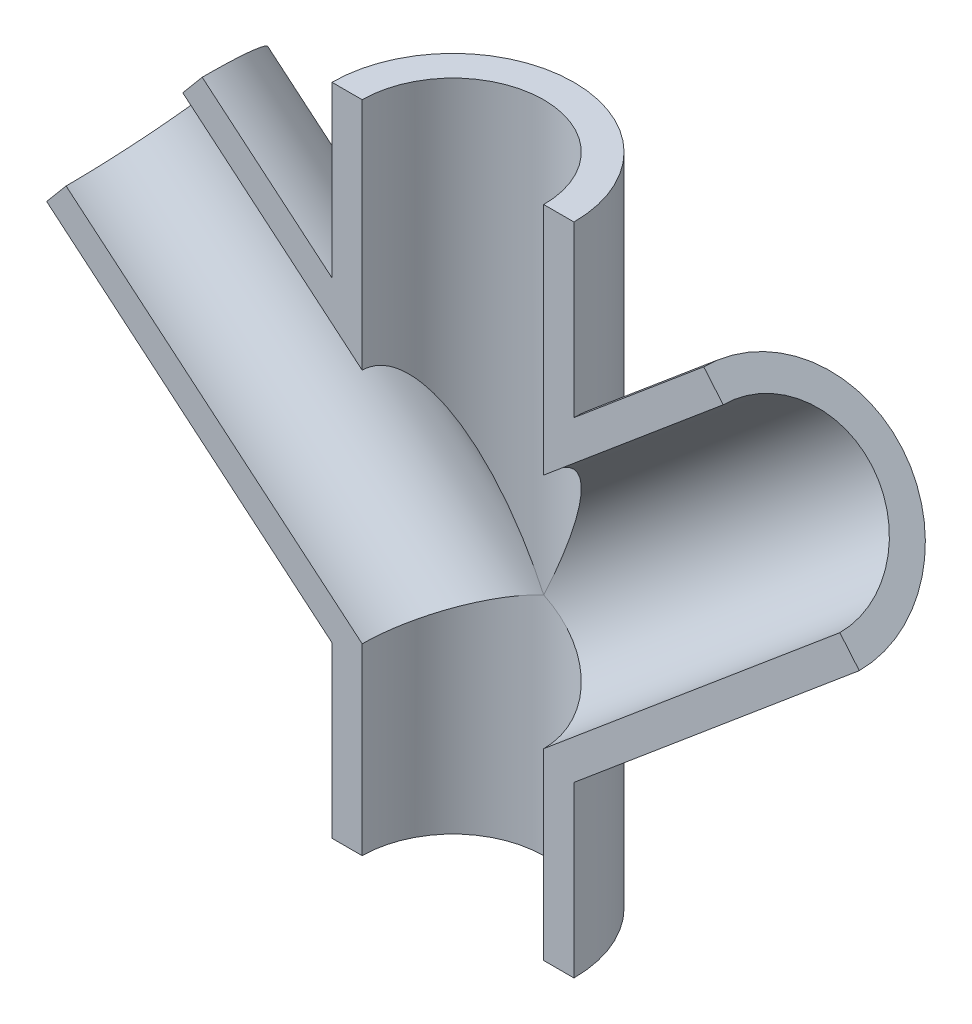
ISO-10303-21;
HEADER;
FILE_DESCRIPTION(('STEP AP214'),'2;1');
FILE_NAME('part.step','',(''),(''),'','','');
FILE_SCHEMA(('AUTOMOTIVE_DESIGN { 1 0 10303 214 1 1 1 1 }'));
ENDSEC;
DATA;
#1=APPLICATION_CONTEXT('core data for automotive mechanical design processes');
#2=APPLICATION_PROTOCOL_DEFINITION('international standard','automotive_design',2000,#1);
#3=PRODUCT_CONTEXT('',#1,'mechanical');
#4=PRODUCT('Part','Part','',(#3));
#5=PRODUCT_RELATED_PRODUCT_CATEGORY('part','',(#4));
#6=PRODUCT_DEFINITION_FORMATION('','',#4);
#7=PRODUCT_DEFINITION_CONTEXT('part definition',#1,'design');
#8=PRODUCT_DEFINITION('design','',#6,#7);
#9=PRODUCT_DEFINITION_SHAPE('','',#8);
#10=(LENGTH_UNIT() NAMED_UNIT(*) SI_UNIT(.MILLI.,.METRE.));
#11=(NAMED_UNIT(*) PLANE_ANGLE_UNIT() SI_UNIT($,.RADIAN.));
#12=(NAMED_UNIT(*) SI_UNIT($,.STERADIAN.) SOLID_ANGLE_UNIT());
#13=UNCERTAINTY_MEASURE_WITH_UNIT(LENGTH_MEASURE(1.E-05),#10,'distance_accuracy_value','');
#14=(GEOMETRIC_REPRESENTATION_CONTEXT(3) GLOBAL_UNCERTAINTY_ASSIGNED_CONTEXT((#13)) GLOBAL_UNIT_ASSIGNED_CONTEXT((#10,
#11,#12)) REPRESENTATION_CONTEXT('',''));
#15=CARTESIAN_POINT('',(0.,0.,0.));
#16=DIRECTION('',(0.,0.,1.));
#17=DIRECTION('',(1.,0.,0.));
#18=AXIS2_PLACEMENT_3D('',#15,#16,#17);
#19=CARTESIAN_POINT('',(0.,0.,0.));
#20=DIRECTION('',(0.,0.,1.));
#21=DIRECTION('',(1.,0.,0.));
#22=AXIS2_PLACEMENT_3D('',#19,#20,#21);
#23=PLANE('',#22);
#24=DIRECTION('',(0.,-1.,0.));
#25=VECTOR('',#24,1.);
#26=CARTESIAN_POINT('',(-5.,7.,0.));
#27=LINE('',#26,#25);
#28=CARTESIAN_POINT('',(-5.,0.,0.));
#29=VERTEX_POINT('',#28);
#30=CARTESIAN_POINT('',(-5.,7.,0.));
#31=VERTEX_POINT('',#30);
#32=EDGE_CURVE('E116',#29,#31,#27,.F.);
#33=ORIENTED_EDGE('',*,*,#32,.F.);
#34=DIRECTION('',(1.,0.,0.));
#35=VECTOR('',#34,1.);
#36=CARTESIAN_POINT('',(-5.,0.,0.));
#37=LINE('',#36,#35);
#38=CARTESIAN_POINT('',(-3.74999999999999,0.,0.));
#39=VERTEX_POINT('',#38);
#40=EDGE_CURVE('E174',#29,#39,#37,.T.);
#41=ORIENTED_EDGE('',*,*,#40,.T.);
#42=DIRECTION('',(0.,1.,0.));
#43=VECTOR('',#42,1.);
#44=CARTESIAN_POINT('',(-3.74999999999999,0.,0.));
#45=LINE('',#44,#43);
#46=CARTESIAN_POINT('',(-3.74999999999999,7.58288457269374,0.));
#47=VERTEX_POINT('',#46);
#48=EDGE_CURVE('E179',#39,#47,#45,.T.);
#49=ORIENTED_EDGE('',*,*,#48,.T.);
#50=DIRECTION('',(-0.766044443118974,0.642787609686544,0.));
#51=VECTOR('',#50,1.);
#52=CARTESIAN_POINT('',(12.0383976240029,-5.66515405048747,0.));
#53=LINE('',#52,#51);
#54=CARTESIAN_POINT('',(-15.9867026865901,17.8506972838376,0.));
#55=VERTEX_POINT('',#54);
#56=EDGE_CURVE('E157',#47,#55,#53,.T.);
#57=ORIENTED_EDGE('',*,*,#56,.T.);
#58=DIRECTION('',(-0.642787609686544,-0.766044443118974,0.));
#59=VECTOR('',#58,1.);
#60=CARTESIAN_POINT('',(-16.7901871986983,16.8931417299389,0.));
#61=LINE('',#60,#59);
#62=CARTESIAN_POINT('',(-16.7901871986983,16.8931417299389,0.));
#63=VERTEX_POINT('',#62);
#64=EDGE_CURVE('E167',#55,#63,#61,.T.);
#65=ORIENTED_EDGE('',*,*,#64,.T.);
#66=DIRECTION('',(0.766044443118974,-0.642787609686544,0.));
#67=VECTOR('',#66,1.);
#68=CARTESIAN_POINT('',(-5.,7.,0.));
#69=LINE('',#68,#67);
#70=EDGE_CURVE('E199',#31,#63,#69,.F.);
#71=ORIENTED_EDGE('',*,*,#70,.F.);
#72=EDGE_LOOP('',(#33,#41,#49,#57,#65,#71));
#73=FACE_BOUND('',#72,.T.);
#74=ADVANCED_FACE('F37',(#73),#23,.T.);
#75=DIRECTION('',(0.,1.,0.));
#76=VECTOR('',#75,1.);
#77=CARTESIAN_POINT('',(-3.74999999999999,0.,0.));
#78=LINE('',#77,#76);
#79=CARTESIAN_POINT('',(-3.74999999999999,17.3734392426859,0.));
#80=VERTEX_POINT('',#79);
#81=CARTESIAN_POINT('',(-3.74999999999999,27.0540728933228,0.));
#82=VERTEX_POINT('',#81);
#83=EDGE_CURVE('E220',#80,#82,#78,.T.);
#84=ORIENTED_EDGE('',*,*,#83,.T.);
#85=DIRECTION('',(-1.,0.,0.));
#86=VECTOR('',#85,1.);
#87=CARTESIAN_POINT('',(-4.99999999999999,27.0540728933228,0.));
#88=LINE('',#87,#86);
#89=CARTESIAN_POINT('',(-4.99999999999999,27.0540728933228,0.));
#90=VERTEX_POINT('',#89);
#91=EDGE_CURVE('E224',#82,#90,#88,.T.);
#92=ORIENTED_EDGE('',*,*,#91,.T.);
#93=DIRECTION('',(0.,-1.,0.));
#94=VECTOR('',#93,1.);
#95=CARTESIAN_POINT('',(-4.99999999999999,20.0540728933228,0.));
#96=LINE('',#95,#94);
#97=CARTESIAN_POINT('',(-4.99999999999999,20.0540728933228,0.));
#98=VERTEX_POINT('',#97);
#99=EDGE_CURVE('E259',#98,#90,#96,.F.);
#100=ORIENTED_EDGE('',*,*,#99,.F.);
#101=DIRECTION('',(-0.766044443118974,0.642787609686544,0.));
#102=VECTOR('',#101,1.);
#103=CARTESIAN_POINT('',(-10.3623111018328,24.5535861611286,0.));
#104=LINE('',#103,#102);
#105=CARTESIAN_POINT('',(-10.3623111018328,24.5535861611286,0.));
#106=VERTEX_POINT('',#105);
#107=EDGE_CURVE('E264',#106,#98,#104,.F.);
#108=ORIENTED_EDGE('',*,*,#107,.F.);
#109=CARTESIAN_POINT('',(-11.165795613941,23.5960306072299,0.));
#110=VERTEX_POINT('',#109);
#111=EDGE_CURVE('E173',#106,#110,#61,.T.);
#112=ORIENTED_EDGE('',*,*,#111,.T.);
#113=DIRECTION('',(-0.766044443118974,0.642787609686544,0.));
#114=VECTOR('',#113,1.);
#115=CARTESIAN_POINT('',(16.859304696652,0.0801792729048277,0.));
#116=LINE('',#115,#114);
#117=EDGE_CURVE('E159',#110,#80,#116,.F.);
#118=ORIENTED_EDGE('',*,*,#117,.T.);
#119=EDGE_LOOP('',(#84,#92,#100,#108,#112,#118));
#120=FACE_BOUND('',#119,.T.);
#121=ADVANCED_FACE('F300',(#120),#23,.T.);
#122=DIRECTION('',(0.,1.,0.));
#123=VECTOR('',#122,1.);
#124=CARTESIAN_POINT('',(3.75000000000001,0.,0.));
#125=LINE('',#124,#123);
#126=CARTESIAN_POINT('',(3.75000000000001,7.58288457269376,0.));
#127=VERTEX_POINT('',#126);
#128=CARTESIAN_POINT('',(3.75000000000001,0.,0.));
#129=VERTEX_POINT('',#128);
#130=EDGE_CURVE('E213',#127,#129,#125,.F.);
#131=ORIENTED_EDGE('',*,*,#130,.T.);
#132=CARTESIAN_POINT('',(5.,0.,0.));
#133=VERTEX_POINT('',#132);
#134=EDGE_CURVE('E227',#129,#133,#37,.T.);
#135=ORIENTED_EDGE('',*,*,#134,.T.);
#136=DIRECTION('',(0.,1.,0.));
#137=VECTOR('',#136,1.);
#138=CARTESIAN_POINT('',(5.,7.,0.));
#139=LINE('',#138,#137);
#140=CARTESIAN_POINT('',(5.,7.,0.));
#141=VERTEX_POINT('',#140);
#142=EDGE_CURVE('E262',#141,#133,#139,.F.);
#143=ORIENTED_EDGE('',*,*,#142,.F.);
#144=DIRECTION('',(0.766044443118975,0.642787609686543,0.));
#145=VECTOR('',#144,1.);
#146=CARTESIAN_POINT('',(5.,7.,0.));
#147=LINE('',#146,#145);
#148=CARTESIAN_POINT('',(16.7901871986983,16.8931417299389,0.));
#149=VERTEX_POINT('',#148);
#150=EDGE_CURVE('E238',#149,#141,#147,.F.);
#151=ORIENTED_EDGE('',*,*,#150,.F.);
#152=DIRECTION('',(-0.642787609686543,0.766044443118975,0.));
#153=VECTOR('',#152,1.);
#154=CARTESIAN_POINT('',(16.7901871986983,16.8931417299389,0.));
#155=LINE('',#154,#153);
#156=CARTESIAN_POINT('',(15.9867026865901,17.8506972838376,0.));
#157=VERTEX_POINT('',#156);
#158=EDGE_CURVE('E229',#149,#157,#155,.T.);
#159=ORIENTED_EDGE('',*,*,#158,.T.);
#160=DIRECTION('',(0.766044443118974,0.642787609686544,0.));
#161=VECTOR('',#160,1.);
#162=CARTESIAN_POINT('',(-12.0383976240029,-5.66515405048747,0.));
#163=LINE('',#162,#161);
#164=EDGE_CURVE('E211',#127,#157,#163,.T.);
#165=ORIENTED_EDGE('',*,*,#164,.F.);
#166=EDGE_LOOP('',(#131,#135,#143,#151,#159,#165));
#167=FACE_BOUND('',#166,.T.);
#168=ADVANCED_FACE('F234',(#167),#23,.T.);
#169=DIRECTION('',(0.766044443118974,0.642787609686544,0.));
#170=VECTOR('',#169,1.);
#171=CARTESIAN_POINT('',(-16.859304696652,0.0801792729048351,0.));
#172=LINE('',#171,#170);
#173=CARTESIAN_POINT('',(11.165795613941,23.5960306072299,0.));
#174=VERTEX_POINT('',#173);
#175=CARTESIAN_POINT('',(3.75000000000001,17.3734392426859,0.));
#176=VERTEX_POINT('',#175);
#177=EDGE_CURVE('E208',#174,#176,#172,.F.);
#178=ORIENTED_EDGE('',*,*,#177,.F.);
#179=CARTESIAN_POINT('',(10.3623111018328,24.5535861611286,0.));
#180=VERTEX_POINT('',#179);
#181=EDGE_CURVE('E181',#174,#180,#155,.T.);
#182=ORIENTED_EDGE('',*,*,#181,.T.);
#183=DIRECTION('',(-0.766044443118975,-0.642787609686543,0.));
#184=VECTOR('',#183,1.);
#185=CARTESIAN_POINT('',(10.3623111018328,24.5535861611286,0.));
#186=LINE('',#185,#184);
#187=CARTESIAN_POINT('',(5.00000000000001,20.0540728933228,0.));
#188=VERTEX_POINT('',#187);
#189=EDGE_CURVE('E47',#188,#180,#186,.F.);
#190=ORIENTED_EDGE('',*,*,#189,.F.);
#191=DIRECTION('',(0.,1.,0.));
#192=VECTOR('',#191,1.);
#193=CARTESIAN_POINT('',(5.00000000000001,20.0540728933228,0.));
#194=LINE('',#193,#192);
#195=CARTESIAN_POINT('',(5.00000000000001,27.0540728933228,0.));
#196=VERTEX_POINT('',#195);
#197=EDGE_CURVE('E253',#196,#188,#194,.F.);
#198=ORIENTED_EDGE('',*,*,#197,.F.);
#199=CARTESIAN_POINT('',(3.75000000000001,27.0540728933228,0.));
#200=VERTEX_POINT('',#199);
#201=EDGE_CURVE('E223',#196,#200,#88,.T.);
#202=ORIENTED_EDGE('',*,*,#201,.T.);
#203=DIRECTION('',(0.,1.,0.));
#204=VECTOR('',#203,1.);
#205=CARTESIAN_POINT('',(3.75000000000001,0.,0.));
#206=LINE('',#205,#204);
#207=EDGE_CURVE('E217',#200,#176,#206,.F.);
#208=ORIENTED_EDGE('',*,*,#207,.T.);
#209=EDGE_LOOP('',(#178,#182,#190,#198,#202,#208));
#210=FACE_BOUND('',#209,.T.);
#211=ADVANCED_FACE('F334',(#210),#23,.T.);
#212=CARTESIAN_POINT('',(0.,0.,0.));
#213=DIRECTION('',(0.,1.,0.));
#214=DIRECTION('',(0.,0.,1.));
#215=AXIS2_PLACEMENT_3D('',#212,#213,#214);
#216=CYLINDRICAL_SURFACE('',#215,3.75);
#217=ORIENTED_EDGE('',*,*,#207,.F.);
#218=CARTESIAN_POINT('',(0.,27.0540728933228,0.));
#219=DIRECTION('',(0.,1.,0.));
#220=DIRECTION('',(0.,0.,1.));
#221=AXIS2_PLACEMENT_3D('',#218,#219,#220);
#222=CIRCLE('',#221,3.75);
#223=EDGE_CURVE('E163',#200,#82,#222,.T.);
#224=ORIENTED_EDGE('',*,*,#223,.T.);
#225=ORIENTED_EDGE('',*,*,#83,.F.);
#226=CARTESIAN_POINT('',(0.,9.33153829077497,0.));
#227=DIRECTION('',(-0.906307787036651,-0.422618261740697,0.));
#228=DIRECTION('',(-0.422618261740697,0.906307787036651,0.));
#229=AXIS2_PLACEMENT_3D('',#226,#227,#228);
#230=ELLIPSE('',#229,8.87325593682192,3.75);
#231=CARTESIAN_POINT('',(0.,9.33153829077497,-3.75));
#232=VERTEX_POINT('',#231);
#233=EDGE_CURVE('E189',#232,#80,#230,.F.);
#234=ORIENTED_EDGE('',*,*,#233,.F.);
#235=CARTESIAN_POINT('',(0.,9.33153829077499,0.));
#236=DIRECTION('',(0.906307787036651,-0.422618261740697,0.));
#237=DIRECTION('',(0.422618261740697,0.906307787036651,0.));
#238=AXIS2_PLACEMENT_3D('',#235,#236,#237);
#239=ELLIPSE('',#238,8.87325593682192,3.75);
#240=EDGE_CURVE('E192',#232,#176,#239,.T.);
#241=ORIENTED_EDGE('',*,*,#240,.T.);
#242=EDGE_LOOP('',(#217,#224,#225,#234,#241));
#243=FACE_BOUND('',#242,.T.);
#244=ADVANCED_FACE('F302',(#243),#216,.F.);
#245=CARTESIAN_POINT('',(-1.78606195156728,10.8302222155949,0.));
#246=DIRECTION('',(-0.766044443118974,0.642787609686544,0.));
#247=DIRECTION('',(-0.642787609686544,-0.766044443118974,0.));
#248=AXIS2_PLACEMENT_3D('',#245,#246,#247);
#249=CYLINDRICAL_SURFACE('',#248,5.);
#250=CARTESIAN_POINT('',(0.,9.33153829077498,0.));
#251=DIRECTION('',(-0.422618261740697,0.906307787036651,0.));
#252=DIRECTION('',(-0.906307787036651,-0.422618261740697,0.));
#253=AXIS2_PLACEMENT_3D('',#250,#251,#252);
#254=ELLIPSE('',#253,5.51688959481245,5.);
#255=CARTESIAN_POINT('',(0.,9.33153829077498,-5.));
#256=VERTEX_POINT('',#255);
#257=EDGE_CURVE('E56',#31,#256,#254,.F.);
#258=ORIENTED_EDGE('',*,*,#257,.F.);
#259=ORIENTED_EDGE('',*,*,#70,.T.);
#260=CARTESIAN_POINT('',(-13.5762491502655,20.7233639455338,0.));
#261=DIRECTION('',(0.766044443118974,-0.642787609686544,0.));
#262=DIRECTION('',(0.642787609686544,0.766044443118974,0.));
#263=AXIS2_PLACEMENT_3D('',#260,#261,#262);
#264=CIRCLE('',#263,5.);
#265=CARTESIAN_POINT('',(-13.5762491502655,20.7233639455338,-5.));
#266=VERTEX_POINT('',#265);
#267=EDGE_CURVE('E171',#266,#63,#264,.F.);
#268=ORIENTED_EDGE('',*,*,#267,.F.);
#269=DIRECTION('',(0.766044443118974,-0.642787609686544,0.));
#270=VECTOR('',#269,1.);
#271=CARTESIAN_POINT('',(-13.5762491502655,20.7233639455338,-5.));
#272=LINE('',#271,#270);
#273=EDGE_CURVE('E266',#256,#266,#272,.F.);
#274=ORIENTED_EDGE('',*,*,#273,.F.);
#275=EDGE_LOOP('',(#258,#259,#268,#274));
#276=FACE_BOUND('',#275,.T.);
#277=ADVANCED_FACE('F329',(#276),#249,.T.);
#278=CARTESIAN_POINT('',(-16.7901871986983,16.8931417299389,5.));
#279=DIRECTION('',(0.766044443118974,-0.642787609686544,0.));
#280=DIRECTION('',(0.642787609686544,0.766044443118974,0.));
#281=AXIS2_PLACEMENT_3D('',#278,#279,#280);
#282=PLANE('',#281);
#283=ORIENTED_EDGE('',*,*,#111,.F.);
#284=CARTESIAN_POINT('',(-13.5762491502655,20.7233639455338,0.));
#285=DIRECTION('',(0.766044443118974,-0.642787609686544,0.));
#286=DIRECTION('',(0.642787609686544,0.766044443118974,0.));
#287=AXIS2_PLACEMENT_3D('',#284,#285,#286);
#288=CIRCLE('',#287,5.);
#289=EDGE_CURVE('E284',#106,#266,#288,.F.);
#290=ORIENTED_EDGE('',*,*,#289,.T.);
#291=ORIENTED_EDGE('',*,*,#267,.T.);
#292=ORIENTED_EDGE('',*,*,#64,.F.);
#293=CARTESIAN_POINT('',(-13.5762491502655,20.7233639455338,0.));
#294=DIRECTION('',(-0.766044443118974,0.642787609686544,0.));
#295=DIRECTION('',(-0.642787609686544,-0.766044443118974,0.));
#296=AXIS2_PLACEMENT_3D('',#293,#294,#295);
#297=CIRCLE('',#296,3.75);
#298=EDGE_CURVE('E153',#110,#55,#297,.T.);
#299=ORIENTED_EDGE('',*,*,#298,.F.);
#300=EDGE_LOOP('',(#283,#290,#291,#292,#299));
#301=FACE_BOUND('',#300,.T.);
#302=ADVANCED_FACE('F168',(#301),#282,.F.);
#303=CARTESIAN_POINT('',(0.,7.,0.));
#304=DIRECTION('',(0.,1.,0.));
#305=DIRECTION('',(-1.,0.,0.));
#306=AXIS2_PLACEMENT_3D('',#303,#304,#305);
#307=CYLINDRICAL_SURFACE('',#306,5.);
#308=ORIENTED_EDGE('',*,*,#32,.T.);
#309=ORIENTED_EDGE('',*,*,#257,.T.);
#310=DIRECTION('',(0.,-1.,0.));
#311=VECTOR('',#310,1.);
#312=CARTESIAN_POINT('',(0.,7.,-5.));
#313=LINE('',#312,#311);
#314=CARTESIAN_POINT('',(0.,0.,-5.));
#315=VERTEX_POINT('',#314);
#316=EDGE_CURVE('E263',#315,#256,#313,.F.);
#317=ORIENTED_EDGE('',*,*,#316,.F.);
#318=CARTESIAN_POINT('',(0.,0.,0.));
#319=DIRECTION('',(0.,1.,0.));
#320=DIRECTION('',(-1.,0.,0.));
#321=AXIS2_PLACEMENT_3D('',#318,#319,#320);
#322=CIRCLE('',#321,5.);
#323=EDGE_CURVE('E210',#29,#315,#322,.F.);
#324=ORIENTED_EDGE('',*,*,#323,.F.);
#325=EDGE_LOOP('',(#308,#309,#317,#324));
#326=FACE_BOUND('',#325,.T.);
#327=ADVANCED_FACE('F320',(#326),#307,.T.);
#328=CARTESIAN_POINT('',(-5.,0.,5.));
#329=DIRECTION('',(0.,1.,0.));
#330=DIRECTION('',(-1.,0.,0.));
#331=AXIS2_PLACEMENT_3D('',#328,#329,#330);
#332=PLANE('',#331);
#333=ORIENTED_EDGE('',*,*,#40,.F.);
#334=ORIENTED_EDGE('',*,*,#323,.T.);
#335=CARTESIAN_POINT('',(0.,0.,0.));
#336=DIRECTION('',(0.,1.,0.));
#337=DIRECTION('',(-1.,0.,0.));
#338=AXIS2_PLACEMENT_3D('',#335,#336,#337);
#339=CIRCLE('',#338,5.);
#340=EDGE_CURVE('E281',#315,#133,#339,.F.);
#341=ORIENTED_EDGE('',*,*,#340,.T.);
#342=ORIENTED_EDGE('',*,*,#134,.F.);
#343=CARTESIAN_POINT('',(0.,0.,0.));
#344=DIRECTION('',(0.,1.,0.));
#345=DIRECTION('',(0.,0.,1.));
#346=AXIS2_PLACEMENT_3D('',#343,#344,#345);
#347=CIRCLE('',#346,3.75);
#348=EDGE_CURVE('E185',#129,#39,#347,.T.);
#349=ORIENTED_EDGE('',*,*,#348,.T.);
#350=EDGE_LOOP('',(#333,#334,#341,#342,#349));
#351=FACE_BOUND('',#350,.T.);
#352=ADVANCED_FACE('F316',(#351),#332,.F.);
#353=CARTESIAN_POINT('',(-13.5762491502655,20.7233639455338,0.));
#354=DIRECTION('',(0.766044443118974,-0.642787609686544,0.));
#355=DIRECTION('',(0.642787609686544,0.766044443118974,0.));
#356=AXIS2_PLACEMENT_3D('',#353,#354,#355);
#357=CYLINDRICAL_SURFACE('',#356,5.);
#358=ORIENTED_EDGE('',*,*,#289,.F.);
#359=ORIENTED_EDGE('',*,*,#107,.T.);
#360=CARTESIAN_POINT('',(0.,9.33153829077496,0.));
#361=DIRECTION('',(0.906307787036651,0.422618261740696,0.));
#362=DIRECTION('',(-0.422618261740696,0.906307787036651,0.));
#363=AXIS2_PLACEMENT_3D('',#360,#361,#362);
#364=ELLIPSE('',#363,11.8310079157626,5.);
#365=EDGE_CURVE('E261',#256,#98,#364,.T.);
#366=ORIENTED_EDGE('',*,*,#365,.F.);
#367=ORIENTED_EDGE('',*,*,#273,.T.);
#368=EDGE_LOOP('',(#358,#359,#366,#367));
#369=FACE_BOUND('',#368,.T.);
#370=ADVANCED_FACE('F327',(#369),#357,.T.);
#371=CARTESIAN_POINT('',(0.,7.,0.));
#372=DIRECTION('',(0.,-1.,0.));
#373=DIRECTION('',(1.,0.,0.));
#374=AXIS2_PLACEMENT_3D('',#371,#372,#373);
#375=CYLINDRICAL_SURFACE('',#374,5.);
#376=ORIENTED_EDGE('',*,*,#340,.F.);
#377=ORIENTED_EDGE('',*,*,#316,.T.);
#378=CARTESIAN_POINT('',(0.,9.33153829077498,0.));
#379=DIRECTION('',(-0.422618261740697,-0.906307787036651,0.));
#380=DIRECTION('',(0.906307787036651,-0.422618261740697,0.));
#381=AXIS2_PLACEMENT_3D('',#378,#379,#380);
#382=ELLIPSE('',#381,5.51688959481245,5.);
#383=EDGE_CURVE('E258',#141,#256,#382,.F.);
#384=ORIENTED_EDGE('',*,*,#383,.F.);
#385=ORIENTED_EDGE('',*,*,#142,.T.);
#386=EDGE_LOOP('',(#376,#377,#384,#385));
#387=FACE_BOUND('',#386,.T.);
#388=ADVANCED_FACE('F318',(#387),#375,.T.);
#389=CARTESIAN_POINT('',(0.,20.0540728933228,0.));
#390=DIRECTION('',(0.,1.,0.));
#391=DIRECTION('',(-1.,0.,0.));
#392=AXIS2_PLACEMENT_3D('',#389,#390,#391);
#393=CYLINDRICAL_SURFACE('',#392,5.);
#394=ORIENTED_EDGE('',*,*,#99,.T.);
#395=CARTESIAN_POINT('',(0.,27.0540728933228,0.));
#396=DIRECTION('',(0.,-1.,0.));
#397=DIRECTION('',(1.,0.,0.));
#398=AXIS2_PLACEMENT_3D('',#395,#396,#397);
#399=CIRCLE('',#398,5.);
#400=CARTESIAN_POINT('',(0.,27.0540728933228,-5.));
#401=VERTEX_POINT('',#400);
#402=EDGE_CURVE('E248',#401,#90,#399,.F.);
#403=ORIENTED_EDGE('',*,*,#402,.F.);
#404=DIRECTION('',(0.,-1.,0.));
#405=VECTOR('',#404,1.);
#406=CARTESIAN_POINT('',(0.,27.0540728933228,-5.));
#407=LINE('',#406,#405);
#408=EDGE_CURVE('E256',#256,#401,#407,.F.);
#409=ORIENTED_EDGE('',*,*,#408,.F.);
#410=ORIENTED_EDGE('',*,*,#365,.T.);
#411=EDGE_LOOP('',(#394,#403,#409,#410));
#412=FACE_BOUND('',#411,.T.);
#413=ADVANCED_FACE('F298',(#412),#393,.T.);
#414=CARTESIAN_POINT('',(-4.99999999999999,27.0540728933228,5.));
#415=DIRECTION('',(0.,-1.,0.));
#416=DIRECTION('',(1.,0.,0.));
#417=AXIS2_PLACEMENT_3D('',#414,#415,#416);
#418=PLANE('',#417);
#419=ORIENTED_EDGE('',*,*,#201,.F.);
#420=CARTESIAN_POINT('',(0.,27.0540728933228,0.));
#421=DIRECTION('',(0.,-1.,0.));
#422=DIRECTION('',(1.,0.,0.));
#423=AXIS2_PLACEMENT_3D('',#420,#421,#422);
#424=CIRCLE('',#423,5.);
#425=EDGE_CURVE('E287',#196,#401,#424,.F.);
#426=ORIENTED_EDGE('',*,*,#425,.T.);
#427=ORIENTED_EDGE('',*,*,#402,.T.);
#428=ORIENTED_EDGE('',*,*,#91,.F.);
#429=ORIENTED_EDGE('',*,*,#223,.F.);
#430=EDGE_LOOP('',(#419,#426,#427,#428,#429));
#431=FACE_BOUND('',#430,.T.);
#432=ADVANCED_FACE('F294',(#431),#418,.F.);
#433=CARTESIAN_POINT('',(0.,20.0540728933228,0.));
#434=DIRECTION('',(0.,-1.,0.));
#435=DIRECTION('',(1.,0.,0.));
#436=AXIS2_PLACEMENT_3D('',#433,#434,#435);
#437=CYLINDRICAL_SURFACE('',#436,5.);
#438=ORIENTED_EDGE('',*,*,#425,.F.);
#439=ORIENTED_EDGE('',*,*,#197,.T.);
#440=CARTESIAN_POINT('',(0.,9.33153829077498,0.));
#441=DIRECTION('',(0.906307787036651,-0.422618261740697,0.));
#442=DIRECTION('',(0.422618261740697,0.906307787036651,0.));
#443=AXIS2_PLACEMENT_3D('',#440,#441,#442);
#444=ELLIPSE('',#443,11.8310079157626,5.);
#445=EDGE_CURVE('E11',#256,#188,#444,.T.);
#446=ORIENTED_EDGE('',*,*,#445,.F.);
#447=ORIENTED_EDGE('',*,*,#408,.T.);
#448=EDGE_LOOP('',(#438,#439,#446,#447));
#449=FACE_BOUND('',#448,.T.);
#450=ADVANCED_FACE('F305',(#449),#437,.T.);
#451=CARTESIAN_POINT('',(1.78606195156729,10.8302222155949,0.));
#452=DIRECTION('',(-0.766044443118975,-0.642787609686543,0.));
#453=DIRECTION('',(0.642787609686543,-0.766044443118975,0.));
#454=AXIS2_PLACEMENT_3D('',#451,#452,#453);
#455=CYLINDRICAL_SURFACE('',#454,5.);
#456=ORIENTED_EDGE('',*,*,#150,.T.);
#457=ORIENTED_EDGE('',*,*,#383,.T.);
#458=DIRECTION('',(0.766044443118975,0.642787609686543,0.));
#459=VECTOR('',#458,1.);
#460=CARTESIAN_POINT('',(1.78606195156729,10.8302222155949,-5.));
#461=LINE('',#460,#459);
#462=CARTESIAN_POINT('',(13.5762491502655,20.7233639455338,-5.));
#463=VERTEX_POINT('',#462);
#464=EDGE_CURVE('E244',#463,#256,#461,.F.);
#465=ORIENTED_EDGE('',*,*,#464,.F.);
#466=CARTESIAN_POINT('',(13.5762491502655,20.7233639455338,0.));
#467=DIRECTION('',(-0.766044443118975,-0.642787609686543,0.));
#468=DIRECTION('',(0.642787609686543,-0.766044443118975,0.));
#469=AXIS2_PLACEMENT_3D('',#466,#467,#468);
#470=CIRCLE('',#469,5.);
#471=EDGE_CURVE('E103',#149,#463,#470,.F.);
#472=ORIENTED_EDGE('',*,*,#471,.F.);
#473=EDGE_LOOP('',(#456,#457,#465,#472));
#474=FACE_BOUND('',#473,.T.);
#475=ADVANCED_FACE('F241',(#474),#455,.T.);
#476=CARTESIAN_POINT('',(16.7901871986983,16.8931417299389,5.));
#477=DIRECTION('',(-0.766044443118975,-0.642787609686543,0.));
#478=DIRECTION('',(0.642787609686543,-0.766044443118975,0.));
#479=AXIS2_PLACEMENT_3D('',#476,#477,#478);
#480=PLANE('',#479);
#481=ORIENTED_EDGE('',*,*,#158,.F.);
#482=ORIENTED_EDGE('',*,*,#471,.T.);
#483=CARTESIAN_POINT('',(13.5762491502655,20.7233639455338,0.));
#484=DIRECTION('',(-0.766044443118975,-0.642787609686543,0.));
#485=DIRECTION('',(0.642787609686543,-0.766044443118975,0.));
#486=AXIS2_PLACEMENT_3D('',#483,#484,#485);
#487=CIRCLE('',#486,5.);
#488=EDGE_CURVE('E246',#463,#180,#487,.F.);
#489=ORIENTED_EDGE('',*,*,#488,.T.);
#490=ORIENTED_EDGE('',*,*,#181,.F.);
#491=CARTESIAN_POINT('',(13.5762491502655,20.7233639455338,0.));
#492=DIRECTION('',(-0.766044443118974,-0.642787609686544,0.));
#493=DIRECTION('',(0.642787609686544,-0.766044443118974,0.));
#494=AXIS2_PLACEMENT_3D('',#491,#492,#493);
#495=CIRCLE('',#494,3.75);
#496=EDGE_CURVE('E41',#174,#157,#495,.T.);
#497=ORIENTED_EDGE('',*,*,#496,.T.);
#498=EDGE_LOOP('',(#481,#482,#489,#490,#497));
#499=FACE_BOUND('',#498,.T.);
#500=ADVANCED_FACE('F239',(#499),#480,.F.);
#501=CARTESIAN_POINT('',(13.5762491502655,20.7233639455338,0.));
#502=DIRECTION('',(0.766044443118975,0.642787609686543,0.));
#503=DIRECTION('',(-0.642787609686543,0.766044443118975,0.));
#504=AXIS2_PLACEMENT_3D('',#501,#502,#503);
#505=CYLINDRICAL_SURFACE('',#504,5.);
#506=ORIENTED_EDGE('',*,*,#488,.F.);
#507=ORIENTED_EDGE('',*,*,#464,.T.);
#508=ORIENTED_EDGE('',*,*,#445,.T.);
#509=ORIENTED_EDGE('',*,*,#189,.T.);
#510=EDGE_LOOP('',(#506,#507,#508,#509));
#511=FACE_BOUND('',#510,.T.);
#512=ADVANCED_FACE('F308',(#511),#505,.T.);
#513=ORIENTED_EDGE('',*,*,#130,.F.);
#514=CARTESIAN_POINT('',(0.,9.33153829077499,0.));
#515=DIRECTION('',(0.422618261740697,0.906307787036651,0.));
#516=DIRECTION('',(0.906307787036651,-0.422618261740697,0.));
#517=AXIS2_PLACEMENT_3D('',#514,#515,#516);
#518=ELLIPSE('',#517,4.13766719610934,3.75);
#519=EDGE_CURVE('E191',#127,#232,#518,.T.);
#520=ORIENTED_EDGE('',*,*,#519,.T.);
#521=CARTESIAN_POINT('',(0.,9.33153829077497,0.));
#522=DIRECTION('',(-0.422618261740697,0.906307787036651,0.));
#523=DIRECTION('',(-0.906307787036651,-0.422618261740697,0.));
#524=AXIS2_PLACEMENT_3D('',#521,#522,#523);
#525=ELLIPSE('',#524,4.13766719610934,3.75);
#526=EDGE_CURVE('E111',#47,#232,#525,.F.);
#527=ORIENTED_EDGE('',*,*,#526,.F.);
#528=ORIENTED_EDGE('',*,*,#48,.F.);
#529=ORIENTED_EDGE('',*,*,#348,.F.);
#530=EDGE_LOOP('',(#513,#520,#527,#528,#529));
#531=FACE_BOUND('',#530,.T.);
#532=ADVANCED_FACE('F312',(#531),#216,.F.);
#533=CARTESIAN_POINT('',(-14.4488511603274,-2.79248738879132,0.));
#534=DIRECTION('',(0.766044443118974,0.642787609686544,0.));
#535=DIRECTION('',(-0.642787609686544,0.766044443118974,0.));
#536=AXIS2_PLACEMENT_3D('',#533,#534,#535);
#537=CYLINDRICAL_SURFACE('',#536,3.75);
#538=ORIENTED_EDGE('',*,*,#519,.F.);
#539=ORIENTED_EDGE('',*,*,#164,.T.);
#540=ORIENTED_EDGE('',*,*,#496,.F.);
#541=ORIENTED_EDGE('',*,*,#177,.T.);
#542=ORIENTED_EDGE('',*,*,#240,.F.);
#543=EDGE_LOOP('',(#538,#539,#540,#541,#542));
#544=FACE_BOUND('',#543,.T.);
#545=ADVANCED_FACE('F39',(#544),#537,.F.);
#546=CARTESIAN_POINT('',(14.4488511603274,-2.79248738879132,0.));
#547=DIRECTION('',(-0.766044443118974,0.642787609686544,0.));
#548=DIRECTION('',(-0.642787609686544,-0.766044443118974,0.));
#549=AXIS2_PLACEMENT_3D('',#546,#547,#548);
#550=CYLINDRICAL_SURFACE('',#549,3.75);
#551=ORIENTED_EDGE('',*,*,#117,.F.);
#552=ORIENTED_EDGE('',*,*,#298,.T.);
#553=ORIENTED_EDGE('',*,*,#56,.F.);
#554=ORIENTED_EDGE('',*,*,#526,.T.);
#555=ORIENTED_EDGE('',*,*,#233,.T.);
#556=EDGE_LOOP('',(#551,#552,#553,#554,#555));
#557=FACE_BOUND('',#556,.T.);
#558=ADVANCED_FACE('F155',(#557),#550,.F.);
#559=CLOSED_SHELL('',(#74,#121,#168,#211,#244,#277,#302,#327,#352,#370,#388,#413,#432,#450,#475,
#500,#512,#532,#545,#558));
#560=MANIFOLD_SOLID_BREP('B2',#559);
#561=ADVANCED_BREP_SHAPE_REPRESENTATION('',(#18,#560),#14);
#562=SHAPE_DEFINITION_REPRESENTATION(#9,#561);
ENDSEC;
END-ISO-10303-21;
